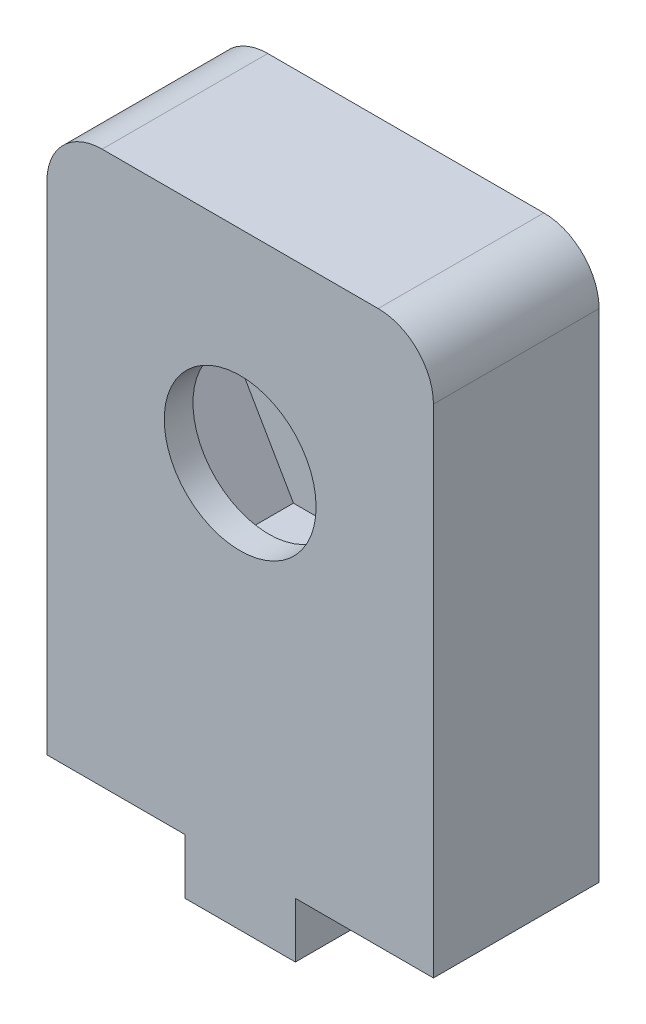
ISO-10303-21;
HEADER;
FILE_DESCRIPTION(('STEP AP214'),'2;1');
FILE_NAME('part.step','',(''),(''),'','','');
FILE_SCHEMA(('AUTOMOTIVE_DESIGN { 1 0 10303 214 1 1 1 1 }'));
ENDSEC;
DATA;
#1=APPLICATION_CONTEXT('core data for automotive mechanical design processes');
#2=APPLICATION_PROTOCOL_DEFINITION('international standard','automotive_design',2000,#1);
#3=PRODUCT_CONTEXT('',#1,'mechanical');
#4=PRODUCT('Part','Part','',(#3));
#5=PRODUCT_RELATED_PRODUCT_CATEGORY('part','',(#4));
#6=PRODUCT_DEFINITION_FORMATION('','',#4);
#7=PRODUCT_DEFINITION_CONTEXT('part definition',#1,'design');
#8=PRODUCT_DEFINITION('design','',#6,#7);
#9=PRODUCT_DEFINITION_SHAPE('','',#8);
#10=(LENGTH_UNIT() NAMED_UNIT(*) SI_UNIT(.MILLI.,.METRE.));
#11=(NAMED_UNIT(*) PLANE_ANGLE_UNIT() SI_UNIT($,.RADIAN.));
#12=(NAMED_UNIT(*) SI_UNIT($,.STERADIAN.) SOLID_ANGLE_UNIT());
#13=UNCERTAINTY_MEASURE_WITH_UNIT(LENGTH_MEASURE(1.E-05),#10,'distance_accuracy_value','');
#14=(GEOMETRIC_REPRESENTATION_CONTEXT(3) GLOBAL_UNCERTAINTY_ASSIGNED_CONTEXT((#13)) GLOBAL_UNIT_ASSIGNED_CONTEXT((#10,
#11,#12)) REPRESENTATION_CONTEXT('',''));
#15=CARTESIAN_POINT('',(0.,0.,0.));
#16=DIRECTION('',(0.,0.,1.));
#17=DIRECTION('',(1.,0.,0.));
#18=AXIS2_PLACEMENT_3D('',#15,#16,#17);
#19=CARTESIAN_POINT('',(0.,1.325,3.));
#20=DIRECTION('',(0.,0.,-1.));
#21=DIRECTION('',(-1.,0.,0.));
#22=AXIS2_PLACEMENT_3D('',#19,#20,#21);
#23=CYLINDRICAL_SURFACE('',#22,1.375);
#24=CARTESIAN_POINT('',(0.,1.325,0.));
#25=DIRECTION('',(0.,0.,1.));
#26=DIRECTION('',(1.,0.,0.));
#27=AXIS2_PLACEMENT_3D('',#24,#25,#26);
#28=CIRCLE('',#27,1.375);
#29=CARTESIAN_POINT('',(1.375,1.325,0.));
#30=VERTEX_POINT('',#29);
#31=EDGE_CURVE('E200',#30,#30,#28,.T.);
#32=ORIENTED_EDGE('',*,*,#31,.F.);
#33=EDGE_LOOP('',(#32));
#34=FACE_BOUND('',#33,.T.);
#35=CARTESIAN_POINT('',(0.,1.325,0.52));
#36=DIRECTION('',(0.,0.,1.));
#37=DIRECTION('',(1.,0.,0.));
#38=AXIS2_PLACEMENT_3D('',#35,#36,#37);
#39=CIRCLE('',#38,1.375);
#40=CARTESIAN_POINT('',(1.375,1.325,0.52));
#41=VERTEX_POINT('',#40);
#42=EDGE_CURVE('E44',#41,#41,#39,.T.);
#43=ORIENTED_EDGE('',*,*,#42,.T.);
#44=EDGE_LOOP('',(#43));
#45=FACE_BOUND('',#44,.T.);
#46=ADVANCED_FACE('F41',(#34,#45),#23,.F.);
#47=CARTESIAN_POINT('',(2.5,4.,3.));
#48=DIRECTION('',(0.,0.,1.));
#49=DIRECTION('',(1.,0.,0.));
#50=AXIS2_PLACEMENT_3D('',#47,#48,#49);
#51=PLANE('',#50);
#52=DIRECTION('',(1.,0.,0.));
#53=VECTOR('',#52,1.);
#54=CARTESIAN_POINT('',(1.,-5.,3.));
#55=LINE('',#54,#53);
#56=CARTESIAN_POINT('',(1.,-5.,3.));
#57=VERTEX_POINT('',#56);
#58=CARTESIAN_POINT('',(3.5,-5.,3.));
#59=VERTEX_POINT('',#58);
#60=EDGE_CURVE('E177',#57,#59,#55,.T.);
#61=ORIENTED_EDGE('',*,*,#60,.T.);
#62=DIRECTION('',(0.,1.,0.));
#63=VECTOR('',#62,1.);
#64=CARTESIAN_POINT('',(3.5,4.,3.));
#65=LINE('',#64,#63);
#66=CARTESIAN_POINT('',(3.5,4.,3.));
#67=VERTEX_POINT('',#66);
#68=EDGE_CURVE('E109',#59,#67,#65,.T.);
#69=ORIENTED_EDGE('',*,*,#68,.T.);
#70=CARTESIAN_POINT('',(2.5,4.,3.));
#71=DIRECTION('',(0.,0.,1.));
#72=DIRECTION('',(1.,0.,0.));
#73=AXIS2_PLACEMENT_3D('',#70,#71,#72);
#74=CIRCLE('',#73,1.);
#75=CARTESIAN_POINT('',(2.5,5.,3.));
#76=VERTEX_POINT('',#75);
#77=EDGE_CURVE('E233',#67,#76,#74,.T.);
#78=ORIENTED_EDGE('',*,*,#77,.T.);
#79=DIRECTION('',(-1.,0.,0.));
#80=VECTOR('',#79,1.);
#81=CARTESIAN_POINT('',(-2.5,5.,3.));
#82=LINE('',#81,#80);
#83=CARTESIAN_POINT('',(-2.5,5.,3.));
#84=VERTEX_POINT('',#83);
#85=EDGE_CURVE('E231',#76,#84,#82,.T.);
#86=ORIENTED_EDGE('',*,*,#85,.T.);
#87=CARTESIAN_POINT('',(-2.5,4.,3.));
#88=DIRECTION('',(0.,0.,1.));
#89=DIRECTION('',(1.,0.,0.));
#90=AXIS2_PLACEMENT_3D('',#87,#88,#89);
#91=CIRCLE('',#90,1.);
#92=CARTESIAN_POINT('',(-3.5,4.,3.));
#93=VERTEX_POINT('',#92);
#94=EDGE_CURVE('E240',#84,#93,#91,.T.);
#95=ORIENTED_EDGE('',*,*,#94,.T.);
#96=DIRECTION('',(0.,-1.,0.));
#97=VECTOR('',#96,1.);
#98=CARTESIAN_POINT('',(-3.5,4.,3.));
#99=LINE('',#98,#97);
#100=CARTESIAN_POINT('',(-3.5,-5.,3.));
#101=VERTEX_POINT('',#100);
#102=EDGE_CURVE('E239',#93,#101,#99,.T.);
#103=ORIENTED_EDGE('',*,*,#102,.T.);
#104=DIRECTION('',(1.,0.,0.));
#105=VECTOR('',#104,1.);
#106=CARTESIAN_POINT('',(-3.5,-5.,3.));
#107=LINE('',#106,#105);
#108=CARTESIAN_POINT('',(-0.999999999999999,-5.,3.));
#109=VERTEX_POINT('',#108);
#110=EDGE_CURVE('E139',#101,#109,#107,.T.);
#111=ORIENTED_EDGE('',*,*,#110,.T.);
#112=DIRECTION('',(0.,-1.,0.));
#113=VECTOR('',#112,1.);
#114=CARTESIAN_POINT('',(-0.999999999999999,-5.,3.));
#115=LINE('',#114,#113);
#116=CARTESIAN_POINT('',(-1.,-6.,3.));
#117=VERTEX_POINT('',#116);
#118=EDGE_CURVE('E135',#109,#117,#115,.T.);
#119=ORIENTED_EDGE('',*,*,#118,.T.);
#120=DIRECTION('',(1.,0.,0.));
#121=VECTOR('',#120,1.);
#122=CARTESIAN_POINT('',(-1.,-6.,3.));
#123=LINE('',#122,#121);
#124=CARTESIAN_POINT('',(1.,-6.,3.));
#125=VERTEX_POINT('',#124);
#126=EDGE_CURVE('E140',#117,#125,#123,.T.);
#127=ORIENTED_EDGE('',*,*,#126,.T.);
#128=DIRECTION('',(0.,1.,0.));
#129=VECTOR('',#128,1.);
#130=CARTESIAN_POINT('',(1.,-6.,3.));
#131=LINE('',#130,#129);
#132=EDGE_CURVE('E58',#125,#57,#131,.T.);
#133=ORIENTED_EDGE('',*,*,#132,.T.);
#134=EDGE_LOOP('',(#61,#69,#78,#86,#95,#103,#111,#119,#127,#133));
#135=FACE_BOUND('',#134,.T.);
#136=CARTESIAN_POINT('',(0.,1.325,3.));
#137=DIRECTION('',(0.,0.,1.));
#138=DIRECTION('',(1.,0.,0.));
#139=AXIS2_PLACEMENT_3D('',#136,#137,#138);
#140=CIRCLE('',#139,1.375);
#141=CARTESIAN_POINT('',(1.375,1.325,3.));
#142=VERTEX_POINT('',#141);
#143=EDGE_CURVE('E161',#142,#142,#140,.T.);
#144=ORIENTED_EDGE('',*,*,#143,.F.);
#145=EDGE_LOOP('',(#144));
#146=FACE_BOUND('',#145,.T.);
#147=ADVANCED_FACE('F131',(#135,#146),#51,.T.);
#148=CARTESIAN_POINT('',(2.5,4.,0.));
#149=DIRECTION('',(0.,0.,1.));
#150=DIRECTION('',(1.,0.,0.));
#151=AXIS2_PLACEMENT_3D('',#148,#149,#150);
#152=PLANE('',#151);
#153=DIRECTION('',(1.,0.,0.));
#154=VECTOR('',#153,1.);
#155=CARTESIAN_POINT('',(1.,-5.,0.));
#156=LINE('',#155,#154);
#157=CARTESIAN_POINT('',(1.,-5.,0.));
#158=VERTEX_POINT('',#157);
#159=CARTESIAN_POINT('',(3.5,-5.,0.));
#160=VERTEX_POINT('',#159);
#161=EDGE_CURVE('E160',#158,#160,#156,.T.);
#162=ORIENTED_EDGE('',*,*,#161,.F.);
#163=DIRECTION('',(0.,1.,0.));
#164=VECTOR('',#163,1.);
#165=CARTESIAN_POINT('',(1.,-6.,0.));
#166=LINE('',#165,#164);
#167=CARTESIAN_POINT('',(1.,-6.,0.));
#168=VERTEX_POINT('',#167);
#169=EDGE_CURVE('E105',#168,#158,#166,.T.);
#170=ORIENTED_EDGE('',*,*,#169,.F.);
#171=DIRECTION('',(1.,0.,0.));
#172=VECTOR('',#171,1.);
#173=CARTESIAN_POINT('',(-1.,-6.,0.));
#174=LINE('',#173,#172);
#175=CARTESIAN_POINT('',(-1.,-6.,0.));
#176=VERTEX_POINT('',#175);
#177=EDGE_CURVE('E96',#176,#168,#174,.T.);
#178=ORIENTED_EDGE('',*,*,#177,.F.);
#179=DIRECTION('',(0.,-1.,0.));
#180=VECTOR('',#179,1.);
#181=CARTESIAN_POINT('',(-0.999999999999999,-5.,0.));
#182=LINE('',#181,#180);
#183=CARTESIAN_POINT('',(-0.999999999999999,-5.,0.));
#184=VERTEX_POINT('',#183);
#185=EDGE_CURVE('E150',#184,#176,#182,.T.);
#186=ORIENTED_EDGE('',*,*,#185,.F.);
#187=DIRECTION('',(1.,0.,0.));
#188=VECTOR('',#187,1.);
#189=CARTESIAN_POINT('',(-3.5,-5.,0.));
#190=LINE('',#189,#188);
#191=CARTESIAN_POINT('',(-3.5,-5.,0.));
#192=VERTEX_POINT('',#191);
#193=EDGE_CURVE('E172',#192,#184,#190,.T.);
#194=ORIENTED_EDGE('',*,*,#193,.F.);
#195=DIRECTION('',(0.,-1.,0.));
#196=VECTOR('',#195,1.);
#197=CARTESIAN_POINT('',(-3.5,4.,0.));
#198=LINE('',#197,#196);
#199=CARTESIAN_POINT('',(-3.5,4.,0.));
#200=VERTEX_POINT('',#199);
#201=EDGE_CURVE('E166',#200,#192,#198,.T.);
#202=ORIENTED_EDGE('',*,*,#201,.F.);
#203=CARTESIAN_POINT('',(-2.5,4.,0.));
#204=DIRECTION('',(0.,0.,1.));
#205=DIRECTION('',(1.,0.,0.));
#206=AXIS2_PLACEMENT_3D('',#203,#204,#205);
#207=CIRCLE('',#206,1.);
#208=CARTESIAN_POINT('',(-2.5,5.,0.));
#209=VERTEX_POINT('',#208);
#210=EDGE_CURVE('E170',#209,#200,#207,.T.);
#211=ORIENTED_EDGE('',*,*,#210,.F.);
#212=DIRECTION('',(-1.,0.,0.));
#213=VECTOR('',#212,1.);
#214=CARTESIAN_POINT('',(-2.5,5.,0.));
#215=LINE('',#214,#213);
#216=CARTESIAN_POINT('',(2.5,5.,0.));
#217=VERTEX_POINT('',#216);
#218=EDGE_CURVE('E164',#217,#209,#215,.T.);
#219=ORIENTED_EDGE('',*,*,#218,.F.);
#220=CARTESIAN_POINT('',(2.5,4.,0.));
#221=DIRECTION('',(0.,0.,1.));
#222=DIRECTION('',(1.,0.,0.));
#223=AXIS2_PLACEMENT_3D('',#220,#221,#222);
#224=CIRCLE('',#223,1.);
#225=CARTESIAN_POINT('',(3.5,4.,0.));
#226=VERTEX_POINT('',#225);
#227=EDGE_CURVE('E162',#226,#217,#224,.T.);
#228=ORIENTED_EDGE('',*,*,#227,.F.);
#229=DIRECTION('',(0.,1.,0.));
#230=VECTOR('',#229,1.);
#231=CARTESIAN_POINT('',(3.5,4.,0.));
#232=LINE('',#231,#230);
#233=EDGE_CURVE('E159',#160,#226,#232,.T.);
#234=ORIENTED_EDGE('',*,*,#233,.F.);
#235=EDGE_LOOP('',(#162,#170,#178,#186,#194,#202,#211,#219,#228,#234));
#236=FACE_BOUND('',#235,.T.);
#237=ORIENTED_EDGE('',*,*,#31,.T.);
#238=EDGE_LOOP('',(#237));
#239=FACE_BOUND('',#238,.T.);
#240=ADVANCED_FACE('F252',(#236,#239),#152,.F.);
#241=CARTESIAN_POINT('',(1.,-5.,3.));
#242=DIRECTION('',(0.,1.,0.));
#243=DIRECTION('',(0.,0.,1.));
#244=AXIS2_PLACEMENT_3D('',#241,#242,#243);
#245=PLANE('',#244);
#246=ORIENTED_EDGE('',*,*,#161,.T.);
#247=DIRECTION('',(0.,0.,-1.));
#248=VECTOR('',#247,1.);
#249=CARTESIAN_POINT('',(3.5,-5.,3.));
#250=LINE('',#249,#248);
#251=EDGE_CURVE('E11',#59,#160,#250,.T.);
#252=ORIENTED_EDGE('',*,*,#251,.F.);
#253=ORIENTED_EDGE('',*,*,#60,.F.);
#254=DIRECTION('',(0.,0.,-1.));
#255=VECTOR('',#254,1.);
#256=CARTESIAN_POINT('',(1.,-5.,3.));
#257=LINE('',#256,#255);
#258=EDGE_CURVE('E153',#57,#158,#257,.T.);
#259=ORIENTED_EDGE('',*,*,#258,.T.);
#260=EDGE_LOOP('',(#246,#252,#253,#259));
#261=FACE_BOUND('',#260,.T.);
#262=ADVANCED_FACE('F43',(#261),#245,.F.);
#263=CARTESIAN_POINT('',(3.5,4.,3.));
#264=DIRECTION('',(-1.,0.,0.));
#265=DIRECTION('',(0.,-1.,0.));
#266=AXIS2_PLACEMENT_3D('',#263,#264,#265);
#267=PLANE('',#266);
#268=ORIENTED_EDGE('',*,*,#233,.T.);
#269=DIRECTION('',(0.,0.,-1.));
#270=VECTOR('',#269,1.);
#271=CARTESIAN_POINT('',(3.5,4.,3.));
#272=LINE('',#271,#270);
#273=EDGE_CURVE('E51',#67,#226,#272,.T.);
#274=ORIENTED_EDGE('',*,*,#273,.F.);
#275=ORIENTED_EDGE('',*,*,#68,.F.);
#276=ORIENTED_EDGE('',*,*,#251,.T.);
#277=EDGE_LOOP('',(#268,#274,#275,#276));
#278=FACE_BOUND('',#277,.T.);
#279=ADVANCED_FACE('F283',(#278),#267,.F.);
#280=CARTESIAN_POINT('',(2.5,4.,3.));
#281=DIRECTION('',(0.,0.,-1.));
#282=DIRECTION('',(-1.,0.,0.));
#283=AXIS2_PLACEMENT_3D('',#280,#281,#282);
#284=CYLINDRICAL_SURFACE('',#283,1.);
#285=ORIENTED_EDGE('',*,*,#227,.T.);
#286=DIRECTION('',(0.,0.,-1.));
#287=VECTOR('',#286,1.);
#288=CARTESIAN_POINT('',(2.5,5.,3.));
#289=LINE('',#288,#287);
#290=EDGE_CURVE('E186',#76,#217,#289,.T.);
#291=ORIENTED_EDGE('',*,*,#290,.F.);
#292=ORIENTED_EDGE('',*,*,#77,.F.);
#293=ORIENTED_EDGE('',*,*,#273,.T.);
#294=EDGE_LOOP('',(#285,#291,#292,#293));
#295=FACE_BOUND('',#294,.T.);
#296=ADVANCED_FACE('F289',(#295),#284,.T.);
#297=CARTESIAN_POINT('',(-2.5,5.,3.));
#298=DIRECTION('',(0.,-1.,0.));
#299=DIRECTION('',(0.,0.,-1.));
#300=AXIS2_PLACEMENT_3D('',#297,#298,#299);
#301=PLANE('',#300);
#302=ORIENTED_EDGE('',*,*,#218,.T.);
#303=DIRECTION('',(0.,0.,-1.));
#304=VECTOR('',#303,1.);
#305=CARTESIAN_POINT('',(-2.5,5.,3.));
#306=LINE('',#305,#304);
#307=EDGE_CURVE('E187',#84,#209,#306,.T.);
#308=ORIENTED_EDGE('',*,*,#307,.F.);
#309=ORIENTED_EDGE('',*,*,#85,.F.);
#310=ORIENTED_EDGE('',*,*,#290,.T.);
#311=EDGE_LOOP('',(#302,#308,#309,#310));
#312=FACE_BOUND('',#311,.T.);
#313=ADVANCED_FACE('F291',(#312),#301,.F.);
#314=CARTESIAN_POINT('',(-2.5,4.,3.));
#315=DIRECTION('',(0.,0.,-1.));
#316=DIRECTION('',(-1.,0.,0.));
#317=AXIS2_PLACEMENT_3D('',#314,#315,#316);
#318=CYLINDRICAL_SURFACE('',#317,1.);
#319=ORIENTED_EDGE('',*,*,#210,.T.);
#320=DIRECTION('',(0.,0.,-1.));
#321=VECTOR('',#320,1.);
#322=CARTESIAN_POINT('',(-3.5,4.,3.));
#323=LINE('',#322,#321);
#324=EDGE_CURVE('E181',#93,#200,#323,.T.);
#325=ORIENTED_EDGE('',*,*,#324,.F.);
#326=ORIENTED_EDGE('',*,*,#94,.F.);
#327=ORIENTED_EDGE('',*,*,#307,.T.);
#328=EDGE_LOOP('',(#319,#325,#326,#327));
#329=FACE_BOUND('',#328,.T.);
#330=ADVANCED_FACE('F296',(#329),#318,.T.);
#331=CARTESIAN_POINT('',(-3.5,4.,3.));
#332=DIRECTION('',(1.,0.,0.));
#333=DIRECTION('',(0.,1.,0.));
#334=AXIS2_PLACEMENT_3D('',#331,#332,#333);
#335=PLANE('',#334);
#336=ORIENTED_EDGE('',*,*,#201,.T.);
#337=DIRECTION('',(0.,0.,-1.));
#338=VECTOR('',#337,1.);
#339=CARTESIAN_POINT('',(-3.5,-5.,3.));
#340=LINE('',#339,#338);
#341=EDGE_CURVE('E176',#101,#192,#340,.T.);
#342=ORIENTED_EDGE('',*,*,#341,.F.);
#343=ORIENTED_EDGE('',*,*,#102,.F.);
#344=ORIENTED_EDGE('',*,*,#324,.T.);
#345=EDGE_LOOP('',(#336,#342,#343,#344));
#346=FACE_BOUND('',#345,.T.);
#347=ADVANCED_FACE('F243',(#346),#335,.F.);
#348=CARTESIAN_POINT('',(-3.5,-5.,3.));
#349=DIRECTION('',(0.,1.,0.));
#350=DIRECTION('',(0.,0.,1.));
#351=AXIS2_PLACEMENT_3D('',#348,#349,#350);
#352=PLANE('',#351);
#353=ORIENTED_EDGE('',*,*,#193,.T.);
#354=DIRECTION('',(0.,0.,-1.));
#355=VECTOR('',#354,1.);
#356=CARTESIAN_POINT('',(-0.999999999999999,-5.,3.));
#357=LINE('',#356,#355);
#358=EDGE_CURVE('E146',#109,#184,#357,.T.);
#359=ORIENTED_EDGE('',*,*,#358,.F.);
#360=ORIENTED_EDGE('',*,*,#110,.F.);
#361=ORIENTED_EDGE('',*,*,#341,.T.);
#362=EDGE_LOOP('',(#353,#359,#360,#361));
#363=FACE_BOUND('',#362,.T.);
#364=ADVANCED_FACE('F249',(#363),#352,.F.);
#365=CARTESIAN_POINT('',(-0.999999999999999,-5.,3.));
#366=DIRECTION('',(1.,0.,0.));
#367=DIRECTION('',(0.,1.,0.));
#368=AXIS2_PLACEMENT_3D('',#365,#366,#367);
#369=PLANE('',#368);
#370=ORIENTED_EDGE('',*,*,#185,.T.);
#371=DIRECTION('',(0.,0.,-1.));
#372=VECTOR('',#371,1.);
#373=CARTESIAN_POINT('',(-1.,-6.,3.));
#374=LINE('',#373,#372);
#375=EDGE_CURVE('E145',#117,#176,#374,.T.);
#376=ORIENTED_EDGE('',*,*,#375,.F.);
#377=ORIENTED_EDGE('',*,*,#118,.F.);
#378=ORIENTED_EDGE('',*,*,#358,.T.);
#379=EDGE_LOOP('',(#370,#376,#377,#378));
#380=FACE_BOUND('',#379,.T.);
#381=ADVANCED_FACE('F144',(#380),#369,.F.);
#382=CARTESIAN_POINT('',(-1.,-6.,3.));
#383=DIRECTION('',(0.,1.,0.));
#384=DIRECTION('',(0.,0.,1.));
#385=AXIS2_PLACEMENT_3D('',#382,#383,#384);
#386=PLANE('',#385);
#387=ORIENTED_EDGE('',*,*,#177,.T.);
#388=DIRECTION('',(0.,0.,-1.));
#389=VECTOR('',#388,1.);
#390=CARTESIAN_POINT('',(1.,-6.,3.));
#391=LINE('',#390,#389);
#392=EDGE_CURVE('E149',#125,#168,#391,.T.);
#393=ORIENTED_EDGE('',*,*,#392,.F.);
#394=ORIENTED_EDGE('',*,*,#126,.F.);
#395=ORIENTED_EDGE('',*,*,#375,.T.);
#396=EDGE_LOOP('',(#387,#393,#394,#395));
#397=FACE_BOUND('',#396,.T.);
#398=ADVANCED_FACE('F151',(#397),#386,.F.);
#399=CARTESIAN_POINT('',(1.,-6.,3.));
#400=DIRECTION('',(-1.,0.,0.));
#401=DIRECTION('',(0.,-1.,0.));
#402=AXIS2_PLACEMENT_3D('',#399,#400,#401);
#403=PLANE('',#402);
#404=ORIENTED_EDGE('',*,*,#169,.T.);
#405=ORIENTED_EDGE('',*,*,#258,.F.);
#406=ORIENTED_EDGE('',*,*,#132,.F.);
#407=ORIENTED_EDGE('',*,*,#392,.T.);
#408=EDGE_LOOP('',(#404,#405,#406,#407));
#409=FACE_BOUND('',#408,.T.);
#410=ADVANCED_FACE('F256',(#409),#403,.F.);
#411=CARTESIAN_POINT('',(0.,1.325,2.48));
#412=DIRECTION('',(0.,0.,1.));
#413=DIRECTION('',(1.,0.,0.));
#414=AXIS2_PLACEMENT_3D('',#411,#412,#413);
#415=CIRCLE('',#414,1.375);
#416=CARTESIAN_POINT('',(1.375,1.325,2.48));
#417=VERTEX_POINT('',#416);
#418=EDGE_CURVE('E193',#417,#417,#415,.T.);
#419=ORIENTED_EDGE('',*,*,#418,.F.);
#420=EDGE_LOOP('',(#419));
#421=FACE_BOUND('',#420,.T.);
#422=ORIENTED_EDGE('',*,*,#143,.T.);
#423=EDGE_LOOP('',(#422));
#424=FACE_BOUND('',#423,.T.);
#425=ADVANCED_FACE('F257',(#421,#424),#23,.F.);
#426=CARTESIAN_POINT('',(1.51554445662277,-1.3,0.52));
#427=DIRECTION('',(0.866025403784439,-0.5,0.));
#428=DIRECTION('',(0.5,0.866025403784439,0.));
#429=AXIS2_PLACEMENT_3D('',#426,#427,#428);
#430=PLANE('',#429);
#431=DIRECTION('',(0.5,0.866025403784439,0.));
#432=VECTOR('',#431,1.);
#433=CARTESIAN_POINT('',(1.51554445662277,-1.3,2.48));
#434=LINE('',#433,#432);
#435=CARTESIAN_POINT('',(1.51554445662277,-1.3,2.48));
#436=VERTEX_POINT('',#435);
#437=CARTESIAN_POINT('',(3.03108891324554,1.325,2.48));
#438=VERTEX_POINT('',#437);
#439=EDGE_CURVE('E414',#436,#438,#434,.T.);
#440=ORIENTED_EDGE('',*,*,#439,.T.);
#441=DIRECTION('',(0.,0.,1.));
#442=VECTOR('',#441,1.);
#443=CARTESIAN_POINT('',(3.03108891324554,1.325,0.52));
#444=LINE('',#443,#442);
#445=CARTESIAN_POINT('',(3.03108891324554,1.325,0.52));
#446=VERTEX_POINT('',#445);
#447=EDGE_CURVE('E224',#446,#438,#444,.T.);
#448=ORIENTED_EDGE('',*,*,#447,.F.);
#449=DIRECTION('',(0.5,0.866025403784439,0.));
#450=VECTOR('',#449,1.);
#451=CARTESIAN_POINT('',(1.51554445662277,-1.3,0.52));
#452=LINE('',#451,#450);
#453=CARTESIAN_POINT('',(1.51554445662277,-1.3,0.52));
#454=VERTEX_POINT('',#453);
#455=EDGE_CURVE('E428',#454,#446,#452,.T.);
#456=ORIENTED_EDGE('',*,*,#455,.F.);
#457=DIRECTION('',(0.,0.,1.));
#458=VECTOR('',#457,1.);
#459=CARTESIAN_POINT('',(1.51554445662277,-1.3,0.52));
#460=LINE('',#459,#458);
#461=EDGE_CURVE('E191',#454,#436,#460,.T.);
#462=ORIENTED_EDGE('',*,*,#461,.T.);
#463=EDGE_LOOP('',(#440,#448,#456,#462));
#464=FACE_BOUND('',#463,.T.);
#465=ADVANCED_FACE('F270',(#464),#430,.F.);
#466=CARTESIAN_POINT('',(-1.51554445662277,-1.3,0.52));
#467=DIRECTION('',(0.,-1.,0.));
#468=DIRECTION('',(1.,0.,0.));
#469=AXIS2_PLACEMENT_3D('',#466,#467,#468);
#470=PLANE('',#469);
#471=DIRECTION('',(1.,0.,0.));
#472=VECTOR('',#471,1.);
#473=CARTESIAN_POINT('',(-1.51554445662277,-1.3,2.48));
#474=LINE('',#473,#472);
#475=CARTESIAN_POINT('',(-1.51554445662277,-1.3,2.48));
#476=VERTEX_POINT('',#475);
#477=EDGE_CURVE('E215',#476,#436,#474,.T.);
#478=ORIENTED_EDGE('',*,*,#477,.T.);
#479=ORIENTED_EDGE('',*,*,#461,.F.);
#480=DIRECTION('',(1.,0.,0.));
#481=VECTOR('',#480,1.);
#482=CARTESIAN_POINT('',(-1.51554445662277,-1.3,0.52));
#483=LINE('',#482,#481);
#484=CARTESIAN_POINT('',(-1.51554445662277,-1.3,0.52));
#485=VERTEX_POINT('',#484);
#486=EDGE_CURVE('E227',#485,#454,#483,.T.);
#487=ORIENTED_EDGE('',*,*,#486,.F.);
#488=DIRECTION('',(0.,0.,1.));
#489=VECTOR('',#488,1.);
#490=CARTESIAN_POINT('',(-1.51554445662277,-1.3,0.52));
#491=LINE('',#490,#489);
#492=EDGE_CURVE('E203',#485,#476,#491,.T.);
#493=ORIENTED_EDGE('',*,*,#492,.T.);
#494=EDGE_LOOP('',(#478,#479,#487,#493));
#495=FACE_BOUND('',#494,.T.);
#496=ADVANCED_FACE('F345',(#495),#470,.F.);
#497=CARTESIAN_POINT('',(-3.03108891324554,1.325,0.52));
#498=DIRECTION('',(-0.866025403784438,-0.5,0.));
#499=DIRECTION('',(0.5,-0.866025403784439,0.));
#500=AXIS2_PLACEMENT_3D('',#497,#498,#499);
#501=PLANE('',#500);
#502=DIRECTION('',(0.5,-0.866025403784438,0.));
#503=VECTOR('',#502,1.);
#504=CARTESIAN_POINT('',(-3.03108891324554,1.325,2.48));
#505=LINE('',#504,#503);
#506=CARTESIAN_POINT('',(-3.03108891324554,1.325,2.48));
#507=VERTEX_POINT('',#506);
#508=EDGE_CURVE('E427',#507,#476,#505,.T.);
#509=ORIENTED_EDGE('',*,*,#508,.T.);
#510=ORIENTED_EDGE('',*,*,#492,.F.);
#511=DIRECTION('',(0.5,-0.866025403784438,0.));
#512=VECTOR('',#511,1.);
#513=CARTESIAN_POINT('',(-3.03108891324554,1.325,0.52));
#514=LINE('',#513,#512);
#515=CARTESIAN_POINT('',(-3.03108891324554,1.325,0.52));
#516=VERTEX_POINT('',#515);
#517=EDGE_CURVE('E444',#516,#485,#514,.T.);
#518=ORIENTED_EDGE('',*,*,#517,.F.);
#519=DIRECTION('',(0.,0.,1.));
#520=VECTOR('',#519,1.);
#521=CARTESIAN_POINT('',(-3.03108891324554,1.325,0.52));
#522=LINE('',#521,#520);
#523=EDGE_CURVE('E207',#516,#507,#522,.T.);
#524=ORIENTED_EDGE('',*,*,#523,.T.);
#525=EDGE_LOOP('',(#509,#510,#518,#524));
#526=FACE_BOUND('',#525,.T.);
#527=ADVANCED_FACE('F348',(#526),#501,.F.);
#528=CARTESIAN_POINT('',(-1.51554445662277,3.95,0.52));
#529=DIRECTION('',(-0.866025403784438,0.5,0.));
#530=DIRECTION('',(-0.5,-0.866025403784439,0.));
#531=AXIS2_PLACEMENT_3D('',#528,#529,#530);
#532=PLANE('',#531);
#533=DIRECTION('',(-0.5,-0.866025403784439,0.));
#534=VECTOR('',#533,1.);
#535=CARTESIAN_POINT('',(-1.51554445662277,3.95,2.48));
#536=LINE('',#535,#534);
#537=CARTESIAN_POINT('',(-1.51554445662277,3.95,2.48));
#538=VERTEX_POINT('',#537);
#539=EDGE_CURVE('E433',#538,#507,#536,.T.);
#540=ORIENTED_EDGE('',*,*,#539,.T.);
#541=ORIENTED_EDGE('',*,*,#523,.F.);
#542=DIRECTION('',(-0.5,-0.866025403784439,0.));
#543=VECTOR('',#542,1.);
#544=CARTESIAN_POINT('',(-1.51554445662277,3.95,0.52));
#545=LINE('',#544,#543);
#546=CARTESIAN_POINT('',(-1.51554445662277,3.95,0.52));
#547=VERTEX_POINT('',#546);
#548=EDGE_CURVE('E447',#547,#516,#545,.T.);
#549=ORIENTED_EDGE('',*,*,#548,.F.);
#550=DIRECTION('',(0.,0.,1.));
#551=VECTOR('',#550,1.);
#552=CARTESIAN_POINT('',(-1.51554445662277,3.95,0.52));
#553=LINE('',#552,#551);
#554=EDGE_CURVE('E220',#547,#538,#553,.T.);
#555=ORIENTED_EDGE('',*,*,#554,.T.);
#556=EDGE_LOOP('',(#540,#541,#549,#555));
#557=FACE_BOUND('',#556,.T.);
#558=ADVANCED_FACE('F356',(#557),#532,.F.);
#559=CARTESIAN_POINT('',(1.51554445662277,3.95,0.52));
#560=DIRECTION('',(0.,1.,0.));
#561=DIRECTION('',(0.,0.,1.));
#562=AXIS2_PLACEMENT_3D('',#559,#560,#561);
#563=PLANE('',#562);
#564=DIRECTION('',(-1.,0.,0.));
#565=VECTOR('',#564,1.);
#566=CARTESIAN_POINT('',(1.51554445662277,3.95,2.48));
#567=LINE('',#566,#565);
#568=CARTESIAN_POINT('',(1.51554445662277,3.95,2.48));
#569=VERTEX_POINT('',#568);
#570=EDGE_CURVE('E434',#569,#538,#567,.T.);
#571=ORIENTED_EDGE('',*,*,#570,.T.);
#572=ORIENTED_EDGE('',*,*,#554,.F.);
#573=DIRECTION('',(-1.,0.,0.));
#574=VECTOR('',#573,1.);
#575=CARTESIAN_POINT('',(1.51554445662277,3.95,0.52));
#576=LINE('',#575,#574);
#577=CARTESIAN_POINT('',(1.51554445662277,3.95,0.52));
#578=VERTEX_POINT('',#577);
#579=EDGE_CURVE('E446',#578,#547,#576,.T.);
#580=ORIENTED_EDGE('',*,*,#579,.F.);
#581=DIRECTION('',(0.,0.,1.));
#582=VECTOR('',#581,1.);
#583=CARTESIAN_POINT('',(1.51554445662277,3.95,0.52));
#584=LINE('',#583,#582);
#585=EDGE_CURVE('E219',#578,#569,#584,.T.);
#586=ORIENTED_EDGE('',*,*,#585,.T.);
#587=EDGE_LOOP('',(#571,#572,#580,#586));
#588=FACE_BOUND('',#587,.T.);
#589=ADVANCED_FACE('F367',(#588),#563,.F.);
#590=CARTESIAN_POINT('',(3.03108891324554,1.325,0.52));
#591=DIRECTION('',(0.866025403784438,0.5,0.));
#592=DIRECTION('',(-0.5,0.866025403784439,0.));
#593=AXIS2_PLACEMENT_3D('',#590,#591,#592);
#594=PLANE('',#593);
#595=DIRECTION('',(-0.5,0.866025403784439,0.));
#596=VECTOR('',#595,1.);
#597=CARTESIAN_POINT('',(3.03108891324554,1.325,2.48));
#598=LINE('',#597,#596);
#599=EDGE_CURVE('E423',#438,#569,#598,.T.);
#600=ORIENTED_EDGE('',*,*,#599,.T.);
#601=ORIENTED_EDGE('',*,*,#585,.F.);
#602=DIRECTION('',(-0.5,0.866025403784439,0.));
#603=VECTOR('',#602,1.);
#604=CARTESIAN_POINT('',(3.03108891324554,1.325,0.52));
#605=LINE('',#604,#603);
#606=EDGE_CURVE('E431',#446,#578,#605,.T.);
#607=ORIENTED_EDGE('',*,*,#606,.F.);
#608=ORIENTED_EDGE('',*,*,#447,.T.);
#609=EDGE_LOOP('',(#600,#601,#607,#608));
#610=FACE_BOUND('',#609,.T.);
#611=ADVANCED_FACE('F379',(#610),#594,.F.);
#612=CARTESIAN_POINT('',(0.,0.,0.52));
#613=DIRECTION('',(0.,0.,1.));
#614=DIRECTION('',(1.,0.,0.));
#615=AXIS2_PLACEMENT_3D('',#612,#613,#614);
#616=PLANE('',#615);
#617=ORIENTED_EDGE('',*,*,#42,.F.);
#618=EDGE_LOOP('',(#617));
#619=FACE_BOUND('',#618,.T.);
#620=ORIENTED_EDGE('',*,*,#455,.T.);
#621=ORIENTED_EDGE('',*,*,#606,.T.);
#622=ORIENTED_EDGE('',*,*,#579,.T.);
#623=ORIENTED_EDGE('',*,*,#548,.T.);
#624=ORIENTED_EDGE('',*,*,#517,.T.);
#625=ORIENTED_EDGE('',*,*,#486,.T.);
#626=EDGE_LOOP('',(#620,#621,#622,#623,#624,#625));
#627=FACE_BOUND('',#626,.T.);
#628=ADVANCED_FACE('F388',(#619,#627),#616,.T.);
#629=CARTESIAN_POINT('',(0.,0.,2.48));
#630=DIRECTION('',(0.,0.,1.));
#631=DIRECTION('',(1.,0.,0.));
#632=AXIS2_PLACEMENT_3D('',#629,#630,#631);
#633=PLANE('',#632);
#634=ORIENTED_EDGE('',*,*,#418,.T.);
#635=EDGE_LOOP('',(#634));
#636=FACE_BOUND('',#635,.T.);
#637=ORIENTED_EDGE('',*,*,#439,.F.);
#638=ORIENTED_EDGE('',*,*,#477,.F.);
#639=ORIENTED_EDGE('',*,*,#508,.F.);
#640=ORIENTED_EDGE('',*,*,#539,.F.);
#641=ORIENTED_EDGE('',*,*,#570,.F.);
#642=ORIENTED_EDGE('',*,*,#599,.F.);
#643=EDGE_LOOP('',(#637,#638,#639,#640,#641,#642));
#644=FACE_BOUND('',#643,.T.);
#645=ADVANCED_FACE('F399',(#636,#644),#633,.F.);
#646=CLOSED_SHELL('',(#46,#147,#240,#262,#279,#296,#313,#330,#347,#364,#381,#398,#410,#425,#465,
#496,#527,#558,#589,#611,#628,#645));
#647=MANIFOLD_SOLID_BREP('B2',#646);
#648=ADVANCED_BREP_SHAPE_REPRESENTATION('',(#18,#647),#14);
#649=SHAPE_DEFINITION_REPRESENTATION(#9,#648);
ENDSEC;
END-ISO-10303-21;
